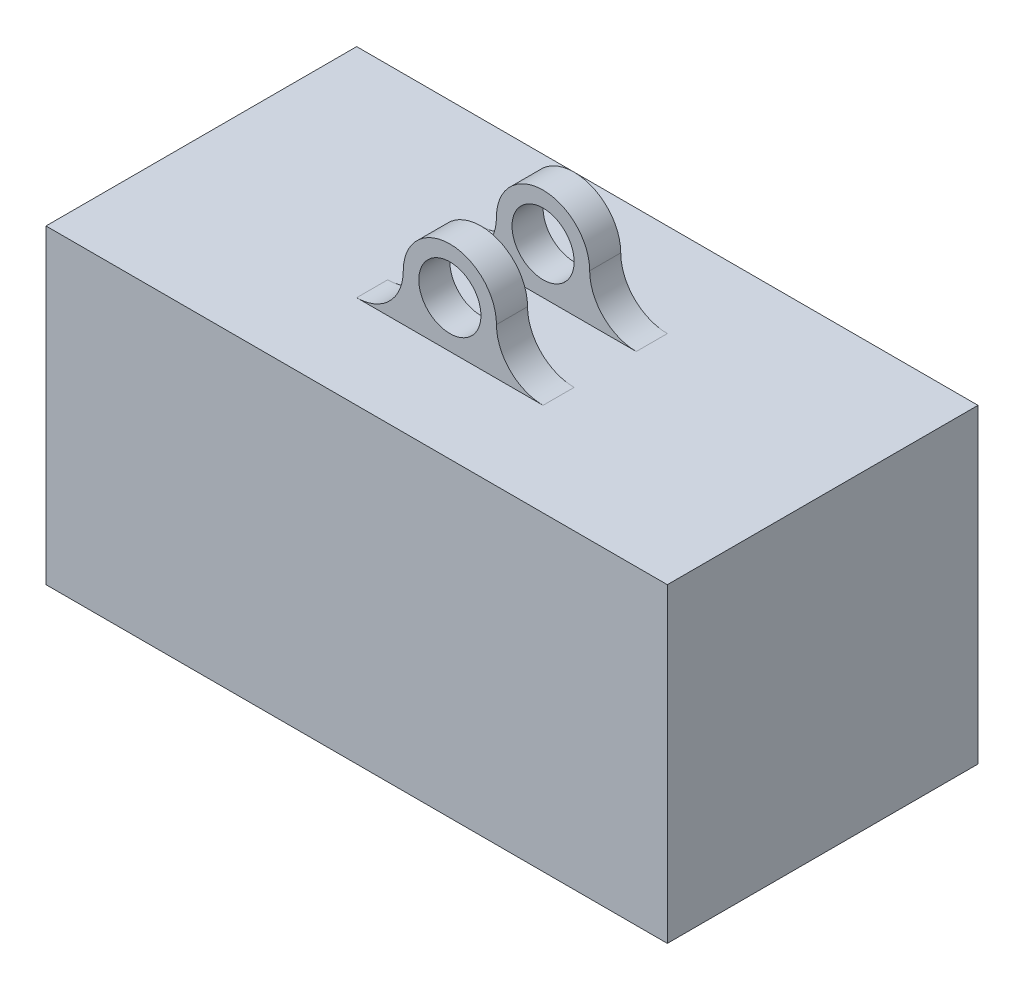
ISO-10303-21;
HEADER;
FILE_DESCRIPTION(('STEP AP214'),'2;1');
FILE_NAME('part.step','',(''),(''),'','','');
FILE_SCHEMA(('AUTOMOTIVE_DESIGN { 1 0 10303 214 1 1 1 1 }'));
ENDSEC;
DATA;
#1=APPLICATION_CONTEXT('core data for automotive mechanical design processes');
#2=APPLICATION_PROTOCOL_DEFINITION('international standard','automotive_design',2000,#1);
#3=PRODUCT_CONTEXT('',#1,'mechanical');
#4=PRODUCT('Part','Part','',(#3));
#5=PRODUCT_RELATED_PRODUCT_CATEGORY('part','',(#4));
#6=PRODUCT_DEFINITION_FORMATION('','',#4);
#7=PRODUCT_DEFINITION_CONTEXT('part definition',#1,'design');
#8=PRODUCT_DEFINITION('design','',#6,#7);
#9=PRODUCT_DEFINITION_SHAPE('','',#8);
#10=(LENGTH_UNIT() NAMED_UNIT(*) SI_UNIT(.MILLI.,.METRE.));
#11=(NAMED_UNIT(*) PLANE_ANGLE_UNIT() SI_UNIT($,.RADIAN.));
#12=(NAMED_UNIT(*) SI_UNIT($,.STERADIAN.) SOLID_ANGLE_UNIT());
#13=UNCERTAINTY_MEASURE_WITH_UNIT(LENGTH_MEASURE(1.E-05),#10,'distance_accuracy_value','');
#14=(GEOMETRIC_REPRESENTATION_CONTEXT(3) GLOBAL_UNCERTAINTY_ASSIGNED_CONTEXT((#13)) GLOBAL_UNIT_ASSIGNED_CONTEXT((#10,
#11,#12)) REPRESENTATION_CONTEXT('',''));
#15=CARTESIAN_POINT('',(0.,0.,0.));
#16=DIRECTION('',(0.,0.,1.));
#17=DIRECTION('',(1.,0.,0.));
#18=AXIS2_PLACEMENT_3D('',#15,#16,#17);
#19=CARTESIAN_POINT('',(6.5,5.75000000000001,-1.));
#20=DIRECTION('',(0.,0.,1.));
#21=DIRECTION('',(1.,0.,0.));
#22=AXIS2_PLACEMENT_3D('',#19,#20,#21);
#23=CYLINDRICAL_SURFACE('',#22,0.750000000000004);
#24=DIRECTION('',(0.,0.,1.));
#25=VECTOR('',#24,1.);
#26=CARTESIAN_POINT('',(5.75,5.75000000000001,-1.));
#27=LINE('',#26,#25);
#28=CARTESIAN_POINT('',(5.75,5.75000000000001,-1.));
#29=VERTEX_POINT('',#28);
#30=CARTESIAN_POINT('',(5.75,5.75000000000001,-0.5));
#31=VERTEX_POINT('',#30);
#32=EDGE_CURVE('E147',#29,#31,#27,.T.);
#33=ORIENTED_EDGE('',*,*,#32,.T.);
#34=CARTESIAN_POINT('',(6.5,5.75000000000001,-0.5));
#35=DIRECTION('',(0.,0.,-1.));
#36=DIRECTION('',(1.,0.,0.));
#37=AXIS2_PLACEMENT_3D('',#34,#35,#36);
#38=CIRCLE('',#37,0.750000000000004);
#39=CARTESIAN_POINT('',(6.5,5.,-0.5));
#40=VERTEX_POINT('',#39);
#41=EDGE_CURVE('E50',#40,#31,#38,.T.);
#42=ORIENTED_EDGE('',*,*,#41,.F.);
#43=DIRECTION('',(0.,0.,1.));
#44=VECTOR('',#43,1.);
#45=CARTESIAN_POINT('',(6.5,5.,-1.));
#46=LINE('',#45,#44);
#47=CARTESIAN_POINT('',(6.5,5.,-1.));
#48=VERTEX_POINT('',#47);
#49=EDGE_CURVE('E156',#48,#40,#46,.T.);
#50=ORIENTED_EDGE('',*,*,#49,.F.);
#51=CARTESIAN_POINT('',(6.5,5.75000000000001,-1.));
#52=DIRECTION('',(0.,0.,-1.));
#53=DIRECTION('',(1.,0.,0.));
#54=AXIS2_PLACEMENT_3D('',#51,#52,#53);
#55=CIRCLE('',#54,0.750000000000004);
#56=EDGE_CURVE('E225',#48,#29,#55,.T.);
#57=ORIENTED_EDGE('',*,*,#56,.T.);
#58=EDGE_LOOP('',(#33,#42,#50,#57));
#59=FACE_BOUND('',#58,.T.);
#60=ADVANCED_FACE('F33',(#59),#23,.F.);
#61=CARTESIAN_POINT('',(3.5,5.75000000000001,-1.));
#62=DIRECTION('',(0.,0.,1.));
#63=DIRECTION('',(1.,0.,0.));
#64=AXIS2_PLACEMENT_3D('',#61,#62,#63);
#65=CYLINDRICAL_SURFACE('',#64,0.750000000000006);
#66=DIRECTION('',(0.,0.,1.));
#67=VECTOR('',#66,1.);
#68=CARTESIAN_POINT('',(3.5,5.,-1.));
#69=LINE('',#68,#67);
#70=CARTESIAN_POINT('',(3.5,5.,-1.));
#71=VERTEX_POINT('',#70);
#72=CARTESIAN_POINT('',(3.5,5.,-0.5));
#73=VERTEX_POINT('',#72);
#74=EDGE_CURVE('E137',#71,#73,#69,.T.);
#75=ORIENTED_EDGE('',*,*,#74,.T.);
#76=CARTESIAN_POINT('',(3.5,5.75000000000001,-0.5));
#77=DIRECTION('',(0.,0.,-1.));
#78=DIRECTION('',(1.,0.,0.));
#79=AXIS2_PLACEMENT_3D('',#76,#77,#78);
#80=CIRCLE('',#79,0.750000000000006);
#81=CARTESIAN_POINT('',(4.25000000000001,5.75000000000001,-0.5));
#82=VERTEX_POINT('',#81);
#83=EDGE_CURVE('E125',#82,#73,#80,.T.);
#84=ORIENTED_EDGE('',*,*,#83,.F.);
#85=DIRECTION('',(0.,0.,1.));
#86=VECTOR('',#85,1.);
#87=CARTESIAN_POINT('',(4.25000000000001,5.75000000000001,-1.));
#88=LINE('',#87,#86);
#89=CARTESIAN_POINT('',(4.25000000000001,5.75000000000001,-1.));
#90=VERTEX_POINT('',#89);
#91=EDGE_CURVE('E134',#90,#82,#88,.T.);
#92=ORIENTED_EDGE('',*,*,#91,.F.);
#93=CARTESIAN_POINT('',(3.5,5.75000000000001,-1.));
#94=DIRECTION('',(0.,0.,-1.));
#95=DIRECTION('',(1.,0.,0.));
#96=AXIS2_PLACEMENT_3D('',#93,#94,#95);
#97=CIRCLE('',#96,0.750000000000006);
#98=EDGE_CURVE('E222',#90,#71,#97,.T.);
#99=ORIENTED_EDGE('',*,*,#98,.T.);
#100=EDGE_LOOP('',(#75,#84,#92,#99));
#101=FACE_BOUND('',#100,.T.);
#102=ADVANCED_FACE('F133',(#101),#65,.F.);
#103=CARTESIAN_POINT('',(5.,5.75000000000001,-1.));
#104=DIRECTION('',(0.,0.,1.));
#105=DIRECTION('',(1.,0.,0.));
#106=AXIS2_PLACEMENT_3D('',#103,#104,#105);
#107=CYLINDRICAL_SURFACE('',#106,0.749999999999999);
#108=ORIENTED_EDGE('',*,*,#91,.T.);
#109=CARTESIAN_POINT('',(5.,5.75000000000001,-0.5));
#110=DIRECTION('',(0.,0.,1.));
#111=DIRECTION('',(1.,0.,0.));
#112=AXIS2_PLACEMENT_3D('',#109,#110,#111);
#113=CIRCLE('',#112,0.749999999999999);
#114=EDGE_CURVE('E122',#31,#82,#113,.T.);
#115=ORIENTED_EDGE('',*,*,#114,.F.);
#116=ORIENTED_EDGE('',*,*,#32,.F.);
#117=CARTESIAN_POINT('',(5.,5.75000000000001,-1.));
#118=DIRECTION('',(0.,0.,1.));
#119=DIRECTION('',(1.,0.,0.));
#120=AXIS2_PLACEMENT_3D('',#117,#118,#119);
#121=CIRCLE('',#120,0.749999999999999);
#122=EDGE_CURVE('E143',#29,#90,#121,.T.);
#123=ORIENTED_EDGE('',*,*,#122,.T.);
#124=EDGE_LOOP('',(#108,#115,#116,#123));
#125=FACE_BOUND('',#124,.T.);
#126=ADVANCED_FACE('F141',(#125),#107,.T.);
#127=CARTESIAN_POINT('',(5.,5.75000000000001,-1.));
#128=DIRECTION('',(0.,0.,1.));
#129=DIRECTION('',(1.,0.,0.));
#130=AXIS2_PLACEMENT_3D('',#127,#128,#129);
#131=CYLINDRICAL_SURFACE('',#130,0.499999999999996);
#132=CARTESIAN_POINT('',(5.,5.75000000000001,-1.));
#133=DIRECTION('',(0.,0.,1.));
#134=DIRECTION('',(1.,0.,0.));
#135=AXIS2_PLACEMENT_3D('',#132,#133,#134);
#136=CIRCLE('',#135,0.499999999999996);
#137=CARTESIAN_POINT('',(5.49999999999999,5.75000000000001,-1.));
#138=VERTEX_POINT('',#137);
#139=EDGE_CURVE('E228',#138,#138,#136,.T.);
#140=ORIENTED_EDGE('',*,*,#139,.F.);
#141=EDGE_LOOP('',(#140));
#142=FACE_BOUND('',#141,.T.);
#143=CARTESIAN_POINT('',(5.,5.75000000000001,-0.5));
#144=DIRECTION('',(0.,0.,1.));
#145=DIRECTION('',(1.,0.,0.));
#146=AXIS2_PLACEMENT_3D('',#143,#144,#145);
#147=CIRCLE('',#146,0.499999999999996);
#148=CARTESIAN_POINT('',(5.49999999999999,5.75000000000001,-0.5));
#149=VERTEX_POINT('',#148);
#150=EDGE_CURVE('E247',#149,#149,#147,.T.);
#151=ORIENTED_EDGE('',*,*,#150,.T.);
#152=EDGE_LOOP('',(#151));
#153=FACE_BOUND('',#152,.T.);
#154=ADVANCED_FACE('F191',(#142,#153),#131,.F.);
#155=CARTESIAN_POINT('',(0.,5.,-2.5));
#156=DIRECTION('',(0.,-1.,0.));
#157=DIRECTION('',(0.,0.,-1.));
#158=AXIS2_PLACEMENT_3D('',#155,#156,#157);
#159=PLANE('',#158);
#160=ORIENTED_EDGE('',*,*,#49,.T.);
#161=DIRECTION('',(1.,0.,0.));
#162=VECTOR('',#161,1.);
#163=CARTESIAN_POINT('',(3.5,5.,-0.5));
#164=LINE('',#163,#162);
#165=EDGE_CURVE('E138',#73,#40,#164,.T.);
#166=ORIENTED_EDGE('',*,*,#165,.F.);
#167=ORIENTED_EDGE('',*,*,#74,.F.);
#168=DIRECTION('',(1.,0.,0.));
#169=VECTOR('',#168,1.);
#170=CARTESIAN_POINT('',(3.5,5.,-1.));
#171=LINE('',#170,#169);
#172=EDGE_CURVE('E219',#71,#48,#171,.T.);
#173=ORIENTED_EDGE('',*,*,#172,.T.);
#174=EDGE_LOOP('',(#160,#166,#167,#173));
#175=FACE_BOUND('',#174,.T.);
#176=DIRECTION('',(0.,0.,1.));
#177=VECTOR('',#176,1.);
#178=CARTESIAN_POINT('',(0.,5.,-2.5));
#179=LINE('',#178,#177);
#180=CARTESIAN_POINT('',(0.,5.,-2.5));
#181=VERTEX_POINT('',#180);
#182=CARTESIAN_POINT('',(0.,5.,2.5));
#183=VERTEX_POINT('',#182);
#184=EDGE_CURVE('E175',#181,#183,#179,.T.);
#185=ORIENTED_EDGE('',*,*,#184,.T.);
#186=DIRECTION('',(1.,0.,0.));
#187=VECTOR('',#186,1.);
#188=CARTESIAN_POINT('',(0.,5.,2.5));
#189=LINE('',#188,#187);
#190=CARTESIAN_POINT('',(10.,5.,2.5));
#191=VERTEX_POINT('',#190);
#192=EDGE_CURVE('E155',#183,#191,#189,.T.);
#193=ORIENTED_EDGE('',*,*,#192,.T.);
#194=DIRECTION('',(0.,0.,1.));
#195=VECTOR('',#194,1.);
#196=CARTESIAN_POINT('',(10.,5.,-2.5));
#197=LINE('',#196,#195);
#198=CARTESIAN_POINT('',(10.,5.,-2.5));
#199=VERTEX_POINT('',#198);
#200=EDGE_CURVE('E37',#199,#191,#197,.T.);
#201=ORIENTED_EDGE('',*,*,#200,.F.);
#202=DIRECTION('',(1.,0.,0.));
#203=VECTOR('',#202,1.);
#204=CARTESIAN_POINT('',(0.,5.,-2.5));
#205=LINE('',#204,#203);
#206=EDGE_CURVE('E167',#181,#199,#205,.T.);
#207=ORIENTED_EDGE('',*,*,#206,.F.);
#208=EDGE_LOOP('',(#185,#193,#201,#207));
#209=FACE_BOUND('',#208,.T.);
#210=DIRECTION('',(1.,0.,0.));
#211=VECTOR('',#210,1.);
#212=CARTESIAN_POINT('',(3.5,5.,0.5));
#213=LINE('',#212,#211);
#214=CARTESIAN_POINT('',(3.5,5.,0.5));
#215=VERTEX_POINT('',#214);
#216=CARTESIAN_POINT('',(6.5,5.,0.5));
#217=VERTEX_POINT('',#216);
#218=EDGE_CURVE('E193',#215,#217,#213,.T.);
#219=ORIENTED_EDGE('',*,*,#218,.T.);
#220=CARTESIAN_POINT('',(6.5,5.,1.));
#221=VERTEX_POINT('',#220);
#222=EDGE_CURVE('E197',#217,#221,#46,.T.);
#223=ORIENTED_EDGE('',*,*,#222,.T.);
#224=DIRECTION('',(1.,0.,0.));
#225=VECTOR('',#224,1.);
#226=CARTESIAN_POINT('',(3.5,5.,1.));
#227=LINE('',#226,#225);
#228=CARTESIAN_POINT('',(3.5,5.,1.));
#229=VERTEX_POINT('',#228);
#230=EDGE_CURVE('E231',#229,#221,#227,.T.);
#231=ORIENTED_EDGE('',*,*,#230,.F.);
#232=EDGE_CURVE('E58',#215,#229,#69,.T.);
#233=ORIENTED_EDGE('',*,*,#232,.F.);
#234=EDGE_LOOP('',(#219,#223,#231,#233));
#235=FACE_BOUND('',#234,.T.);
#236=ADVANCED_FACE('F188',(#175,#209,#235),#159,.F.);
#237=CARTESIAN_POINT('',(10.,0.,-2.5));
#238=DIRECTION('',(-1.,0.,0.));
#239=DIRECTION('',(0.,0.,1.));
#240=AXIS2_PLACEMENT_3D('',#237,#238,#239);
#241=PLANE('',#240);
#242=ORIENTED_EDGE('',*,*,#200,.T.);
#243=DIRECTION('',(0.,-1.,0.));
#244=VECTOR('',#243,1.);
#245=CARTESIAN_POINT('',(10.,0.,2.5));
#246=LINE('',#245,#244);
#247=CARTESIAN_POINT('',(10.,0.,2.5));
#248=VERTEX_POINT('',#247);
#249=EDGE_CURVE('E152',#191,#248,#246,.T.);
#250=ORIENTED_EDGE('',*,*,#249,.T.);
#251=DIRECTION('',(0.,0.,1.));
#252=VECTOR('',#251,1.);
#253=CARTESIAN_POINT('',(10.,0.,-2.5));
#254=LINE('',#253,#252);
#255=CARTESIAN_POINT('',(10.,0.,-2.5));
#256=VERTEX_POINT('',#255);
#257=EDGE_CURVE('E11',#256,#248,#254,.T.);
#258=ORIENTED_EDGE('',*,*,#257,.F.);
#259=DIRECTION('',(0.,-1.,0.));
#260=VECTOR('',#259,1.);
#261=CARTESIAN_POINT('',(10.,0.,-2.5));
#262=LINE('',#261,#260);
#263=EDGE_CURVE('E165',#199,#256,#262,.T.);
#264=ORIENTED_EDGE('',*,*,#263,.F.);
#265=EDGE_LOOP('',(#242,#250,#258,#264));
#266=FACE_BOUND('',#265,.T.);
#267=ADVANCED_FACE('F35',(#266),#241,.F.);
#268=CARTESIAN_POINT('',(0.,0.,-2.5));
#269=DIRECTION('',(0.,-1.,0.));
#270=DIRECTION('',(0.,0.,-1.));
#271=AXIS2_PLACEMENT_3D('',#268,#269,#270);
#272=PLANE('',#271);
#273=ORIENTED_EDGE('',*,*,#257,.T.);
#274=DIRECTION('',(1.,0.,0.));
#275=VECTOR('',#274,1.);
#276=CARTESIAN_POINT('',(0.,0.,2.5));
#277=LINE('',#276,#275);
#278=CARTESIAN_POINT('',(0.,0.,2.5));
#279=VERTEX_POINT('',#278);
#280=EDGE_CURVE('E162',#279,#248,#277,.T.);
#281=ORIENTED_EDGE('',*,*,#280,.F.);
#282=DIRECTION('',(0.,0.,1.));
#283=VECTOR('',#282,1.);
#284=CARTESIAN_POINT('',(0.,0.,-2.5));
#285=LINE('',#284,#283);
#286=CARTESIAN_POINT('',(0.,0.,-2.5));
#287=VERTEX_POINT('',#286);
#288=EDGE_CURVE('E42',#287,#279,#285,.T.);
#289=ORIENTED_EDGE('',*,*,#288,.F.);
#290=DIRECTION('',(1.,0.,0.));
#291=VECTOR('',#290,1.);
#292=CARTESIAN_POINT('',(0.,0.,-2.5));
#293=LINE('',#292,#291);
#294=EDGE_CURVE('E172',#287,#256,#293,.T.);
#295=ORIENTED_EDGE('',*,*,#294,.T.);
#296=EDGE_LOOP('',(#273,#281,#289,#295));
#297=FACE_BOUND('',#296,.T.);
#298=ADVANCED_FACE('F283',(#297),#272,.T.);
#299=CARTESIAN_POINT('',(0.,0.,-2.5));
#300=DIRECTION('',(-1.,0.,0.));
#301=DIRECTION('',(0.,-1.,0.));
#302=AXIS2_PLACEMENT_3D('',#299,#300,#301);
#303=PLANE('',#302);
#304=ORIENTED_EDGE('',*,*,#288,.T.);
#305=DIRECTION('',(0.,-1.,0.));
#306=VECTOR('',#305,1.);
#307=CARTESIAN_POINT('',(0.,0.,2.5));
#308=LINE('',#307,#306);
#309=EDGE_CURVE('E159',#183,#279,#308,.T.);
#310=ORIENTED_EDGE('',*,*,#309,.F.);
#311=ORIENTED_EDGE('',*,*,#184,.F.);
#312=DIRECTION('',(0.,-1.,0.));
#313=VECTOR('',#312,1.);
#314=CARTESIAN_POINT('',(0.,0.,-2.5));
#315=LINE('',#314,#313);
#316=EDGE_CURVE('E169',#181,#287,#315,.T.);
#317=ORIENTED_EDGE('',*,*,#316,.T.);
#318=EDGE_LOOP('',(#304,#310,#311,#317));
#319=FACE_BOUND('',#318,.T.);
#320=ADVANCED_FACE('F279',(#319),#303,.T.);
#321=CARTESIAN_POINT('',(0.,0.,-2.5));
#322=DIRECTION('',(0.,0.,1.));
#323=DIRECTION('',(1.,0.,0.));
#324=AXIS2_PLACEMENT_3D('',#321,#322,#323);
#325=PLANE('',#324);
#326=ORIENTED_EDGE('',*,*,#263,.T.);
#327=ORIENTED_EDGE('',*,*,#294,.F.);
#328=ORIENTED_EDGE('',*,*,#316,.F.);
#329=ORIENTED_EDGE('',*,*,#206,.T.);
#330=EDGE_LOOP('',(#326,#327,#328,#329));
#331=FACE_BOUND('',#330,.T.);
#332=ADVANCED_FACE('F275',(#331),#325,.F.);
#333=CARTESIAN_POINT('',(0.,0.,2.5));
#334=DIRECTION('',(0.,0.,1.));
#335=DIRECTION('',(1.,0.,0.));
#336=AXIS2_PLACEMENT_3D('',#333,#334,#335);
#337=PLANE('',#336);
#338=ORIENTED_EDGE('',*,*,#249,.F.);
#339=ORIENTED_EDGE('',*,*,#192,.F.);
#340=ORIENTED_EDGE('',*,*,#309,.T.);
#341=ORIENTED_EDGE('',*,*,#280,.T.);
#342=EDGE_LOOP('',(#338,#339,#340,#341));
#343=FACE_BOUND('',#342,.T.);
#344=ADVANCED_FACE('F186',(#343),#337,.T.);
#345=CARTESIAN_POINT('',(6.5,5.75000000000001,0.5));
#346=DIRECTION('',(0.,0.,-1.));
#347=DIRECTION('',(1.,0.,0.));
#348=AXIS2_PLACEMENT_3D('',#345,#346,#347);
#349=CIRCLE('',#348,0.750000000000004);
#350=CARTESIAN_POINT('',(5.75,5.75000000000001,0.5));
#351=VERTEX_POINT('',#350);
#352=EDGE_CURVE('E204',#217,#351,#349,.T.);
#353=ORIENTED_EDGE('',*,*,#352,.T.);
#354=CARTESIAN_POINT('',(5.75,5.75000000000001,1.));
#355=VERTEX_POINT('',#354);
#356=EDGE_CURVE('E151',#351,#355,#27,.T.);
#357=ORIENTED_EDGE('',*,*,#356,.T.);
#358=CARTESIAN_POINT('',(6.5,5.75000000000001,1.));
#359=DIRECTION('',(0.,0.,-1.));
#360=DIRECTION('',(1.,0.,0.));
#361=AXIS2_PLACEMENT_3D('',#358,#359,#360);
#362=CIRCLE('',#361,0.750000000000004);
#363=EDGE_CURVE('E216',#221,#355,#362,.T.);
#364=ORIENTED_EDGE('',*,*,#363,.F.);
#365=ORIENTED_EDGE('',*,*,#222,.F.);
#366=EDGE_LOOP('',(#353,#357,#364,#365));
#367=FACE_BOUND('',#366,.T.);
#368=ADVANCED_FACE('F214',(#367),#23,.F.);
#369=CARTESIAN_POINT('',(3.5,5.75000000000001,0.5));
#370=DIRECTION('',(0.,0.,-1.));
#371=DIRECTION('',(1.,0.,0.));
#372=AXIS2_PLACEMENT_3D('',#369,#370,#371);
#373=CIRCLE('',#372,0.750000000000006);
#374=CARTESIAN_POINT('',(4.25000000000001,5.75000000000001,0.5));
#375=VERTEX_POINT('',#374);
#376=EDGE_CURVE('E201',#375,#215,#373,.T.);
#377=ORIENTED_EDGE('',*,*,#376,.T.);
#378=ORIENTED_EDGE('',*,*,#232,.T.);
#379=CARTESIAN_POINT('',(3.5,5.75000000000001,1.));
#380=DIRECTION('',(0.,0.,-1.));
#381=DIRECTION('',(1.,0.,0.));
#382=AXIS2_PLACEMENT_3D('',#379,#380,#381);
#383=CIRCLE('',#382,0.750000000000006);
#384=CARTESIAN_POINT('',(4.25000000000001,5.75000000000001,1.));
#385=VERTEX_POINT('',#384);
#386=EDGE_CURVE('E233',#385,#229,#383,.T.);
#387=ORIENTED_EDGE('',*,*,#386,.F.);
#388=EDGE_CURVE('E144',#375,#385,#88,.T.);
#389=ORIENTED_EDGE('',*,*,#388,.F.);
#390=EDGE_LOOP('',(#377,#378,#387,#389));
#391=FACE_BOUND('',#390,.T.);
#392=ADVANCED_FACE('F266',(#391),#65,.F.);
#393=CARTESIAN_POINT('',(5.,5.75000000000001,0.5));
#394=DIRECTION('',(0.,0.,1.));
#395=DIRECTION('',(1.,0.,0.));
#396=AXIS2_PLACEMENT_3D('',#393,#394,#395);
#397=CIRCLE('',#396,0.749999999999999);
#398=EDGE_CURVE('E208',#351,#375,#397,.T.);
#399=ORIENTED_EDGE('',*,*,#398,.T.);
#400=ORIENTED_EDGE('',*,*,#388,.T.);
#401=CARTESIAN_POINT('',(5.,5.75000000000001,1.));
#402=DIRECTION('',(0.,0.,1.));
#403=DIRECTION('',(1.,0.,0.));
#404=AXIS2_PLACEMENT_3D('',#401,#402,#403);
#405=CIRCLE('',#404,0.749999999999999);
#406=EDGE_CURVE('E235',#355,#385,#405,.T.);
#407=ORIENTED_EDGE('',*,*,#406,.F.);
#408=ORIENTED_EDGE('',*,*,#356,.F.);
#409=EDGE_LOOP('',(#399,#400,#407,#408));
#410=FACE_BOUND('',#409,.T.);
#411=ADVANCED_FACE('F274',(#410),#107,.T.);
#412=CARTESIAN_POINT('',(6.5,5.75000000000001,-1.));
#413=DIRECTION('',(0.,0.,1.));
#414=DIRECTION('',(1.,0.,0.));
#415=AXIS2_PLACEMENT_3D('',#412,#413,#414);
#416=PLANE('',#415);
#417=ORIENTED_EDGE('',*,*,#139,.T.);
#418=EDGE_LOOP('',(#417));
#419=FACE_BOUND('',#418,.T.);
#420=ORIENTED_EDGE('',*,*,#56,.F.);
#421=ORIENTED_EDGE('',*,*,#172,.F.);
#422=ORIENTED_EDGE('',*,*,#98,.F.);
#423=ORIENTED_EDGE('',*,*,#122,.F.);
#424=EDGE_LOOP('',(#420,#421,#422,#423));
#425=FACE_BOUND('',#424,.T.);
#426=ADVANCED_FACE('F310',(#419,#425),#416,.F.);
#427=CARTESIAN_POINT('',(5.,5.75000000000001,0.5));
#428=DIRECTION('',(0.,0.,1.));
#429=DIRECTION('',(1.,0.,0.));
#430=AXIS2_PLACEMENT_3D('',#427,#428,#429);
#431=CIRCLE('',#430,0.499999999999996);
#432=CARTESIAN_POINT('',(5.49999999999999,5.75000000000001,0.5));
#433=VERTEX_POINT('',#432);
#434=EDGE_CURVE('E211',#433,#433,#431,.T.);
#435=ORIENTED_EDGE('',*,*,#434,.F.);
#436=EDGE_LOOP('',(#435));
#437=FACE_BOUND('',#436,.T.);
#438=CARTESIAN_POINT('',(5.,5.75000000000001,1.));
#439=DIRECTION('',(0.,0.,1.));
#440=DIRECTION('',(1.,0.,0.));
#441=AXIS2_PLACEMENT_3D('',#438,#439,#440);
#442=CIRCLE('',#441,0.499999999999996);
#443=CARTESIAN_POINT('',(5.49999999999999,5.75000000000001,1.));
#444=VERTEX_POINT('',#443);
#445=EDGE_CURVE('E200',#444,#444,#442,.T.);
#446=ORIENTED_EDGE('',*,*,#445,.T.);
#447=EDGE_LOOP('',(#446));
#448=FACE_BOUND('',#447,.T.);
#449=ADVANCED_FACE('F315',(#437,#448),#131,.F.);
#450=CARTESIAN_POINT('',(6.5,5.75000000000001,1.));
#451=DIRECTION('',(0.,0.,1.));
#452=DIRECTION('',(1.,0.,0.));
#453=AXIS2_PLACEMENT_3D('',#450,#451,#452);
#454=PLANE('',#453);
#455=ORIENTED_EDGE('',*,*,#363,.T.);
#456=ORIENTED_EDGE('',*,*,#406,.T.);
#457=ORIENTED_EDGE('',*,*,#386,.T.);
#458=ORIENTED_EDGE('',*,*,#230,.T.);
#459=EDGE_LOOP('',(#455,#456,#457,#458));
#460=FACE_BOUND('',#459,.T.);
#461=ORIENTED_EDGE('',*,*,#445,.F.);
#462=EDGE_LOOP('',(#461));
#463=FACE_BOUND('',#462,.T.);
#464=ADVANCED_FACE('F257',(#460,#463),#454,.T.);
#465=CARTESIAN_POINT('',(6.5,5.75000000000001,0.5));
#466=DIRECTION('',(0.,0.,1.));
#467=DIRECTION('',(1.,0.,0.));
#468=AXIS2_PLACEMENT_3D('',#465,#466,#467);
#469=PLANE('',#468);
#470=ORIENTED_EDGE('',*,*,#352,.F.);
#471=ORIENTED_EDGE('',*,*,#218,.F.);
#472=ORIENTED_EDGE('',*,*,#376,.F.);
#473=ORIENTED_EDGE('',*,*,#398,.F.);
#474=EDGE_LOOP('',(#470,#471,#472,#473));
#475=FACE_BOUND('',#474,.T.);
#476=ORIENTED_EDGE('',*,*,#434,.T.);
#477=EDGE_LOOP('',(#476));
#478=FACE_BOUND('',#477,.T.);
#479=ADVANCED_FACE('F205',(#475,#478),#469,.F.);
#480=CARTESIAN_POINT('',(6.5,5.75000000000001,-0.5));
#481=DIRECTION('',(0.,0.,1.));
#482=DIRECTION('',(1.,0.,0.));
#483=AXIS2_PLACEMENT_3D('',#480,#481,#482);
#484=PLANE('',#483);
#485=ORIENTED_EDGE('',*,*,#150,.F.);
#486=EDGE_LOOP('',(#485));
#487=FACE_BOUND('',#486,.T.);
#488=ORIENTED_EDGE('',*,*,#41,.T.);
#489=ORIENTED_EDGE('',*,*,#114,.T.);
#490=ORIENTED_EDGE('',*,*,#83,.T.);
#491=ORIENTED_EDGE('',*,*,#165,.T.);
#492=EDGE_LOOP('',(#488,#489,#490,#491));
#493=FACE_BOUND('',#492,.T.);
#494=ADVANCED_FACE('F124',(#487,#493),#484,.T.);
#495=CLOSED_SHELL('',(#60,#102,#126,#154,#236,#267,#298,#320,#332,#344,#368,#392,#411,#426,#449,
#464,#479,#494));
#496=MANIFOLD_SOLID_BREP('B2',#495);
#497=ADVANCED_BREP_SHAPE_REPRESENTATION('',(#18,#496),#14);
#498=SHAPE_DEFINITION_REPRESENTATION(#9,#497);
ENDSEC;
END-ISO-10303-21;
